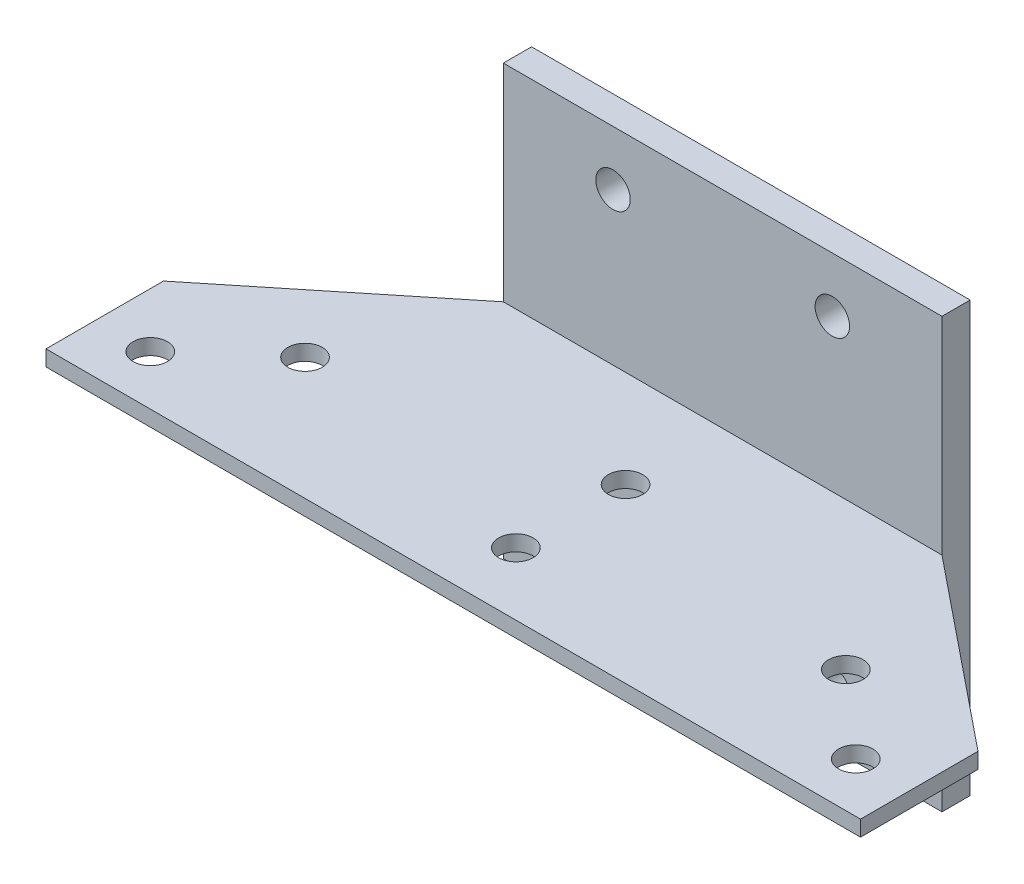
ISO-10303-21;
HEADER;
FILE_DESCRIPTION(('STEP AP214'),'2;1');
FILE_NAME('part.step','',(''),(''),'','','');
FILE_SCHEMA(('AUTOMOTIVE_DESIGN { 1 0 10303 214 1 1 1 1 }'));
ENDSEC;
DATA;
#1=APPLICATION_CONTEXT('core data for automotive mechanical design processes');
#2=APPLICATION_PROTOCOL_DEFINITION('international standard','automotive_design',2000,#1);
#3=PRODUCT_CONTEXT('',#1,'mechanical');
#4=PRODUCT('Part','Part','',(#3));
#5=PRODUCT_RELATED_PRODUCT_CATEGORY('part','',(#4));
#6=PRODUCT_DEFINITION_FORMATION('','',#4);
#7=PRODUCT_DEFINITION_CONTEXT('part definition',#1,'design');
#8=PRODUCT_DEFINITION('design','',#6,#7);
#9=PRODUCT_DEFINITION_SHAPE('','',#8);
#10=(LENGTH_UNIT() NAMED_UNIT(*) SI_UNIT(.MILLI.,.METRE.));
#11=(NAMED_UNIT(*) PLANE_ANGLE_UNIT() SI_UNIT($,.RADIAN.));
#12=(NAMED_UNIT(*) SI_UNIT($,.STERADIAN.) SOLID_ANGLE_UNIT());
#13=UNCERTAINTY_MEASURE_WITH_UNIT(LENGTH_MEASURE(1.E-05),#10,'distance_accuracy_value','');
#14=(GEOMETRIC_REPRESENTATION_CONTEXT(3) GLOBAL_UNCERTAINTY_ASSIGNED_CONTEXT((#13)) GLOBAL_UNIT_ASSIGNED_CONTEXT((#10,
#11,#12)) REPRESENTATION_CONTEXT('',''));
#15=CARTESIAN_POINT('',(0.,0.,0.));
#16=DIRECTION('',(0.,0.,1.));
#17=DIRECTION('',(1.,0.,0.));
#18=AXIS2_PLACEMENT_3D('',#15,#16,#17);
#19=CARTESIAN_POINT('',(0.,274.,18.));
#20=DIRECTION('',(0.,0.,-1.));
#21=DIRECTION('',(-1.,0.,0.));
#22=AXIS2_PLACEMENT_3D('',#19,#20,#21);
#23=PLANE('',#22);
#24=CARTESIAN_POINT('',(70.,239.,18.));
#25=DIRECTION('',(0.,0.,-1.));
#26=DIRECTION('',(-1.,0.,0.));
#27=AXIS2_PLACEMENT_3D('',#24,#25,#26);
#28=CIRCLE('',#27,11.);
#29=CARTESIAN_POINT('',(59.,239.,18.));
#30=VERTEX_POINT('',#29);
#31=EDGE_CURVE('E214',#30,#30,#28,.T.);
#32=ORIENTED_EDGE('',*,*,#31,.T.);
#33=EDGE_LOOP('',(#32));
#34=FACE_BOUND('',#33,.T.);
#35=CARTESIAN_POINT('',(210.,239.,18.));
#36=DIRECTION('',(0.,0.,-1.));
#37=DIRECTION('',(-1.,0.,0.));
#38=AXIS2_PLACEMENT_3D('',#35,#36,#37);
#39=CIRCLE('',#38,11.);
#40=CARTESIAN_POINT('',(199.,239.,18.));
#41=VERTEX_POINT('',#40);
#42=EDGE_CURVE('E226',#41,#41,#39,.T.);
#43=ORIENTED_EDGE('',*,*,#42,.T.);
#44=EDGE_LOOP('',(#43));
#45=FACE_BOUND('',#44,.T.);
#46=DIRECTION('',(-1.,0.,0.));
#47=VECTOR('',#46,1.);
#48=CARTESIAN_POINT('',(-120.,142.,18.));
#49=LINE('',#48,#47);
#50=CARTESIAN_POINT('',(280.,142.,18.));
#51=VERTEX_POINT('',#50);
#52=CARTESIAN_POINT('',(0.,142.,18.));
#53=VERTEX_POINT('',#52);
#54=EDGE_CURVE('E173',#51,#53,#49,.T.);
#55=ORIENTED_EDGE('',*,*,#54,.F.);
#56=DIRECTION('',(0.,1.,0.));
#57=VECTOR('',#56,1.);
#58=CARTESIAN_POINT('',(280.,0.,18.));
#59=LINE('',#58,#57);
#60=CARTESIAN_POINT('',(280.,274.,18.));
#61=VERTEX_POINT('',#60);
#62=EDGE_CURVE('E148',#51,#61,#59,.T.);
#63=ORIENTED_EDGE('',*,*,#62,.T.);
#64=DIRECTION('',(-1.,0.,0.));
#65=VECTOR('',#64,1.);
#66=CARTESIAN_POINT('',(0.,274.,18.));
#67=LINE('',#66,#65);
#68=CARTESIAN_POINT('',(0.,274.,18.));
#69=VERTEX_POINT('',#68);
#70=EDGE_CURVE('E151',#61,#69,#67,.T.);
#71=ORIENTED_EDGE('',*,*,#70,.T.);
#72=DIRECTION('',(0.,-1.,0.));
#73=VECTOR('',#72,1.);
#74=CARTESIAN_POINT('',(0.,0.,18.));
#75=LINE('',#74,#73);
#76=EDGE_CURVE('E141',#69,#53,#75,.T.);
#77=ORIENTED_EDGE('',*,*,#76,.T.);
#78=EDGE_LOOP('',(#55,#63,#71,#77));
#79=FACE_BOUND('',#78,.T.);
#80=ADVANCED_FACE('F31',(#34,#45,#79),#23,.F.);
#81=CARTESIAN_POINT('',(70.,35.,18.));
#82=DIRECTION('',(0.,0.,-1.));
#83=DIRECTION('',(-1.,0.,0.));
#84=AXIS2_PLACEMENT_3D('',#81,#82,#83);
#85=CIRCLE('',#84,11.);
#86=CARTESIAN_POINT('',(59.,35.,18.));
#87=VERTEX_POINT('',#86);
#88=EDGE_CURVE('E220',#87,#87,#85,.T.);
#89=ORIENTED_EDGE('',*,*,#88,.T.);
#90=EDGE_LOOP('',(#89));
#91=FACE_BOUND('',#90,.T.);
#92=CARTESIAN_POINT('',(210.,35.,18.));
#93=DIRECTION('',(0.,0.,-1.));
#94=DIRECTION('',(-1.,0.,0.));
#95=AXIS2_PLACEMENT_3D('',#92,#93,#94);
#96=CIRCLE('',#95,11.);
#97=CARTESIAN_POINT('',(199.,35.,18.));
#98=VERTEX_POINT('',#97);
#99=EDGE_CURVE('E127',#98,#98,#96,.T.);
#100=ORIENTED_EDGE('',*,*,#99,.T.);
#101=EDGE_LOOP('',(#100));
#102=FACE_BOUND('',#101,.T.);
#103=DIRECTION('',(1.,0.,0.));
#104=VECTOR('',#103,1.);
#105=CARTESIAN_POINT('',(-120.,132.,18.));
#106=LINE('',#105,#104);
#107=CARTESIAN_POINT('',(0.,132.,18.));
#108=VERTEX_POINT('',#107);
#109=CARTESIAN_POINT('',(280.,132.,18.));
#110=VERTEX_POINT('',#109);
#111=EDGE_CURVE('E126',#108,#110,#106,.T.);
#112=ORIENTED_EDGE('',*,*,#111,.F.);
#113=CARTESIAN_POINT('',(0.,0.,18.));
#114=VERTEX_POINT('',#113);
#115=EDGE_CURVE('E146',#108,#114,#75,.T.);
#116=ORIENTED_EDGE('',*,*,#115,.T.);
#117=DIRECTION('',(1.,0.,0.));
#118=VECTOR('',#117,1.);
#119=CARTESIAN_POINT('',(0.,0.,18.));
#120=LINE('',#119,#118);
#121=CARTESIAN_POINT('',(280.,0.,18.));
#122=VERTEX_POINT('',#121);
#123=EDGE_CURVE('E144',#114,#122,#120,.T.);
#124=ORIENTED_EDGE('',*,*,#123,.T.);
#125=EDGE_CURVE('E149',#122,#110,#59,.T.);
#126=ORIENTED_EDGE('',*,*,#125,.T.);
#127=EDGE_LOOP('',(#112,#116,#124,#126));
#128=FACE_BOUND('',#127,.T.);
#129=ADVANCED_FACE('F280',(#91,#102,#128),#23,.F.);
#130=CARTESIAN_POINT('',(0.,0.,18.));
#131=DIRECTION('',(1.,0.,0.));
#132=DIRECTION('',(0.,0.,-1.));
#133=AXIS2_PLACEMENT_3D('',#130,#131,#132);
#134=PLANE('',#133);
#135=DIRECTION('',(0.,-1.,0.));
#136=VECTOR('',#135,1.);
#137=CARTESIAN_POINT('',(0.,0.,0.));
#138=LINE('',#137,#136);
#139=CARTESIAN_POINT('',(0.,274.,0.));
#140=VERTEX_POINT('',#139);
#141=CARTESIAN_POINT('',(0.,0.,0.));
#142=VERTEX_POINT('',#141);
#143=EDGE_CURVE('E135',#140,#142,#138,.T.);
#144=ORIENTED_EDGE('',*,*,#143,.T.);
#145=DIRECTION('',(0.,0.,-1.));
#146=VECTOR('',#145,1.);
#147=CARTESIAN_POINT('',(0.,0.,18.));
#148=LINE('',#147,#146);
#149=EDGE_CURVE('E170',#114,#142,#148,.T.);
#150=ORIENTED_EDGE('',*,*,#149,.F.);
#151=ORIENTED_EDGE('',*,*,#115,.F.);
#152=EDGE_CURVE('E145',#53,#108,#75,.T.);
#153=ORIENTED_EDGE('',*,*,#152,.F.);
#154=ORIENTED_EDGE('',*,*,#76,.F.);
#155=DIRECTION('',(0.,0.,-1.));
#156=VECTOR('',#155,1.);
#157=CARTESIAN_POINT('',(0.,274.,18.));
#158=LINE('',#157,#156);
#159=EDGE_CURVE('E153',#69,#140,#158,.T.);
#160=ORIENTED_EDGE('',*,*,#159,.T.);
#161=EDGE_LOOP('',(#144,#150,#151,#153,#154,#160));
#162=FACE_BOUND('',#161,.T.);
#163=ADVANCED_FACE('F33',(#162),#134,.F.);
#164=CARTESIAN_POINT('',(0.,0.,18.));
#165=DIRECTION('',(0.,1.,0.));
#166=DIRECTION('',(0.,0.,1.));
#167=AXIS2_PLACEMENT_3D('',#164,#165,#166);
#168=PLANE('',#167);
#169=DIRECTION('',(1.,0.,0.));
#170=VECTOR('',#169,1.);
#171=CARTESIAN_POINT('',(0.,0.,0.));
#172=LINE('',#171,#170);
#173=CARTESIAN_POINT('',(280.,0.,0.));
#174=VERTEX_POINT('',#173);
#175=EDGE_CURVE('E156',#142,#174,#172,.T.);
#176=ORIENTED_EDGE('',*,*,#175,.T.);
#177=DIRECTION('',(0.,0.,-1.));
#178=VECTOR('',#177,1.);
#179=CARTESIAN_POINT('',(280.,0.,18.));
#180=LINE('',#179,#178);
#181=EDGE_CURVE('E167',#122,#174,#180,.T.);
#182=ORIENTED_EDGE('',*,*,#181,.F.);
#183=ORIENTED_EDGE('',*,*,#123,.F.);
#184=ORIENTED_EDGE('',*,*,#149,.T.);
#185=EDGE_LOOP('',(#176,#182,#183,#184));
#186=FACE_BOUND('',#185,.T.);
#187=ADVANCED_FACE('F277',(#186),#168,.F.);
#188=CARTESIAN_POINT('',(280.,0.,18.));
#189=DIRECTION('',(-1.,0.,0.));
#190=DIRECTION('',(0.,0.,1.));
#191=AXIS2_PLACEMENT_3D('',#188,#189,#190);
#192=PLANE('',#191);
#193=DIRECTION('',(0.,1.,0.));
#194=VECTOR('',#193,1.);
#195=CARTESIAN_POINT('',(280.,0.,0.));
#196=LINE('',#195,#194);
#197=CARTESIAN_POINT('',(280.,274.,0.));
#198=VERTEX_POINT('',#197);
#199=EDGE_CURVE('E158',#174,#198,#196,.T.);
#200=ORIENTED_EDGE('',*,*,#199,.T.);
#201=DIRECTION('',(0.,0.,-1.));
#202=VECTOR('',#201,1.);
#203=CARTESIAN_POINT('',(280.,274.,18.));
#204=LINE('',#203,#202);
#205=EDGE_CURVE('E164',#61,#198,#204,.T.);
#206=ORIENTED_EDGE('',*,*,#205,.F.);
#207=ORIENTED_EDGE('',*,*,#62,.F.);
#208=EDGE_CURVE('E56',#110,#51,#59,.T.);
#209=ORIENTED_EDGE('',*,*,#208,.F.);
#210=ORIENTED_EDGE('',*,*,#125,.F.);
#211=ORIENTED_EDGE('',*,*,#181,.T.);
#212=EDGE_LOOP('',(#200,#206,#207,#209,#210,#211));
#213=FACE_BOUND('',#212,.T.);
#214=ADVANCED_FACE('F282',(#213),#192,.F.);
#215=CARTESIAN_POINT('',(0.,274.,18.));
#216=DIRECTION('',(0.,-1.,0.));
#217=DIRECTION('',(0.,0.,-1.));
#218=AXIS2_PLACEMENT_3D('',#215,#216,#217);
#219=PLANE('',#218);
#220=DIRECTION('',(-1.,0.,0.));
#221=VECTOR('',#220,1.);
#222=CARTESIAN_POINT('',(0.,274.,0.));
#223=LINE('',#222,#221);
#224=EDGE_CURVE('E160',#198,#140,#223,.T.);
#225=ORIENTED_EDGE('',*,*,#224,.T.);
#226=ORIENTED_EDGE('',*,*,#159,.F.);
#227=ORIENTED_EDGE('',*,*,#70,.F.);
#228=ORIENTED_EDGE('',*,*,#205,.T.);
#229=EDGE_LOOP('',(#225,#226,#227,#228));
#230=FACE_BOUND('',#229,.T.);
#231=ADVANCED_FACE('F268',(#230),#219,.F.);
#232=CARTESIAN_POINT('',(0.,274.,0.));
#233=DIRECTION('',(0.,0.,-1.));
#234=DIRECTION('',(-1.,0.,0.));
#235=AXIS2_PLACEMENT_3D('',#232,#233,#234);
#236=PLANE('',#235);
#237=CARTESIAN_POINT('',(70.,239.,0.));
#238=DIRECTION('',(0.,0.,-1.));
#239=DIRECTION('',(-1.,0.,0.));
#240=AXIS2_PLACEMENT_3D('',#237,#238,#239);
#241=CIRCLE('',#240,11.);
#242=CARTESIAN_POINT('',(59.,239.,0.));
#243=VERTEX_POINT('',#242);
#244=EDGE_CURVE('E178',#243,#243,#241,.T.);
#245=ORIENTED_EDGE('',*,*,#244,.F.);
#246=EDGE_LOOP('',(#245));
#247=FACE_BOUND('',#246,.T.);
#248=CARTESIAN_POINT('',(70.,35.,0.));
#249=DIRECTION('',(0.,0.,-1.));
#250=DIRECTION('',(-1.,0.,0.));
#251=AXIS2_PLACEMENT_3D('',#248,#249,#250);
#252=CIRCLE('',#251,11.);
#253=CARTESIAN_POINT('',(59.,35.,0.));
#254=VERTEX_POINT('',#253);
#255=EDGE_CURVE('E217',#254,#254,#252,.T.);
#256=ORIENTED_EDGE('',*,*,#255,.F.);
#257=EDGE_LOOP('',(#256));
#258=FACE_BOUND('',#257,.T.);
#259=CARTESIAN_POINT('',(210.,239.,0.));
#260=DIRECTION('',(0.,0.,-1.));
#261=DIRECTION('',(-1.,0.,0.));
#262=AXIS2_PLACEMENT_3D('',#259,#260,#261);
#263=CIRCLE('',#262,11.);
#264=CARTESIAN_POINT('',(199.,239.,0.));
#265=VERTEX_POINT('',#264);
#266=EDGE_CURVE('E223',#265,#265,#263,.T.);
#267=ORIENTED_EDGE('',*,*,#266,.F.);
#268=EDGE_LOOP('',(#267));
#269=FACE_BOUND('',#268,.T.);
#270=CARTESIAN_POINT('',(210.,35.,0.));
#271=DIRECTION('',(0.,0.,-1.));
#272=DIRECTION('',(-1.,0.,0.));
#273=AXIS2_PLACEMENT_3D('',#270,#271,#272);
#274=CIRCLE('',#273,11.);
#275=CARTESIAN_POINT('',(199.,35.,0.));
#276=VERTEX_POINT('',#275);
#277=EDGE_CURVE('E229',#276,#276,#274,.T.);
#278=ORIENTED_EDGE('',*,*,#277,.F.);
#279=EDGE_LOOP('',(#278));
#280=FACE_BOUND('',#279,.T.);
#281=ORIENTED_EDGE('',*,*,#143,.F.);
#282=ORIENTED_EDGE('',*,*,#224,.F.);
#283=ORIENTED_EDGE('',*,*,#199,.F.);
#284=ORIENTED_EDGE('',*,*,#175,.F.);
#285=EDGE_LOOP('',(#281,#282,#283,#284));
#286=FACE_BOUND('',#285,.T.);
#287=ADVANCED_FACE('F272',(#247,#258,#269,#280,#286),#236,.T.);
#288=CARTESIAN_POINT('',(-120.,142.,190.));
#289=DIRECTION('',(1.,0.,0.));
#290=DIRECTION('',(0.,0.,-1.));
#291=AXIS2_PLACEMENT_3D('',#288,#289,#290);
#292=PLANE('',#291);
#293=DIRECTION('',(0.,0.,-1.));
#294=VECTOR('',#293,1.);
#295=CARTESIAN_POINT('',(-120.,142.,190.));
#296=LINE('',#295,#294);
#297=CARTESIAN_POINT('',(-120.,142.,190.));
#298=VERTEX_POINT('',#297);
#299=CARTESIAN_POINT('',(-120.,142.,115.));
#300=VERTEX_POINT('',#299);
#301=EDGE_CURVE('E137',#298,#300,#296,.T.);
#302=ORIENTED_EDGE('',*,*,#301,.T.);
#303=DIRECTION('',(0.,-1.,0.));
#304=VECTOR('',#303,1.);
#305=CARTESIAN_POINT('',(-120.,274.,115.));
#306=LINE('',#305,#304);
#307=CARTESIAN_POINT('',(-120.,132.,115.));
#308=VERTEX_POINT('',#307);
#309=EDGE_CURVE('E48',#300,#308,#306,.T.);
#310=ORIENTED_EDGE('',*,*,#309,.T.);
#311=DIRECTION('',(0.,0.,-1.));
#312=VECTOR('',#311,1.);
#313=CARTESIAN_POINT('',(-120.,132.,190.));
#314=LINE('',#313,#312);
#315=CARTESIAN_POINT('',(-120.,132.,190.));
#316=VERTEX_POINT('',#315);
#317=EDGE_CURVE('E131',#316,#308,#314,.T.);
#318=ORIENTED_EDGE('',*,*,#317,.F.);
#319=DIRECTION('',(0.,-1.,0.));
#320=VECTOR('',#319,1.);
#321=CARTESIAN_POINT('',(-120.,142.,190.));
#322=LINE('',#321,#320);
#323=EDGE_CURVE('E236',#298,#316,#322,.T.);
#324=ORIENTED_EDGE('',*,*,#323,.F.);
#325=EDGE_LOOP('',(#302,#310,#318,#324));
#326=FACE_BOUND('',#325,.T.);
#327=ADVANCED_FACE('F250',(#326),#292,.F.);
#328=CARTESIAN_POINT('',(-120.,132.,190.));
#329=DIRECTION('',(0.,1.,0.));
#330=DIRECTION('',(-1.,0.,0.));
#331=AXIS2_PLACEMENT_3D('',#328,#329,#330);
#332=PLANE('',#331);
#333=CARTESIAN_POINT('',(312.636595866121,132.,112.));
#334=DIRECTION('',(0.,-1.,0.));
#335=DIRECTION('',(1.,0.,0.));
#336=AXIS2_PLACEMENT_3D('',#333,#334,#335);
#337=CIRCLE('',#336,11.);
#338=CARTESIAN_POINT('',(323.636595866121,132.,112.));
#339=VERTEX_POINT('',#338);
#340=EDGE_CURVE('E203',#339,#339,#337,.T.);
#341=ORIENTED_EDGE('',*,*,#340,.F.);
#342=EDGE_LOOP('',(#341));
#343=FACE_BOUND('',#342,.T.);
#344=CARTESIAN_POINT('',(365.189055635979,132.,158.241096139014));
#345=DIRECTION('',(0.,-1.,0.));
#346=DIRECTION('',(1.,0.,0.));
#347=AXIS2_PLACEMENT_3D('',#344,#345,#346);
#348=CIRCLE('',#347,11.);
#349=CARTESIAN_POINT('',(376.189055635979,132.,158.241096139014));
#350=VERTEX_POINT('',#349);
#351=EDGE_CURVE('E193',#350,#350,#348,.T.);
#352=ORIENTED_EDGE('',*,*,#351,.F.);
#353=EDGE_LOOP('',(#352));
#354=FACE_BOUND('',#353,.T.);
#355=CARTESIAN_POINT('',(-32.6365958661213,132.,112.));
#356=DIRECTION('',(0.,-1.,0.));
#357=DIRECTION('',(1.,0.,0.));
#358=AXIS2_PLACEMENT_3D('',#355,#356,#357);
#359=CIRCLE('',#358,11.);
#360=CARTESIAN_POINT('',(-21.6365958661213,132.,112.));
#361=VERTEX_POINT('',#360);
#362=EDGE_CURVE('E190',#361,#361,#359,.T.);
#363=ORIENTED_EDGE('',*,*,#362,.F.);
#364=EDGE_LOOP('',(#363));
#365=FACE_BOUND('',#364,.T.);
#366=CARTESIAN_POINT('',(-85.1890556359789,132.,158.241096139014));
#367=DIRECTION('',(0.,-1.,0.));
#368=DIRECTION('',(1.,0.,0.));
#369=AXIS2_PLACEMENT_3D('',#366,#367,#368);
#370=CIRCLE('',#369,11.);
#371=CARTESIAN_POINT('',(-74.1890556359789,132.,158.241096139014));
#372=VERTEX_POINT('',#371);
#373=EDGE_CURVE('E187',#372,#372,#370,.T.);
#374=ORIENTED_EDGE('',*,*,#373,.F.);
#375=EDGE_LOOP('',(#374));
#376=FACE_BOUND('',#375,.T.);
#377=CARTESIAN_POINT('',(140.,132.,150.));
#378=DIRECTION('',(0.,-1.,0.));
#379=DIRECTION('',(1.,0.,0.));
#380=AXIS2_PLACEMENT_3D('',#377,#378,#379);
#381=CIRCLE('',#380,11.);
#382=CARTESIAN_POINT('',(151.,132.,150.));
#383=VERTEX_POINT('',#382);
#384=EDGE_CURVE('E183',#383,#383,#381,.T.);
#385=ORIENTED_EDGE('',*,*,#384,.F.);
#386=EDGE_LOOP('',(#385));
#387=FACE_BOUND('',#386,.T.);
#388=CARTESIAN_POINT('',(140.,132.,80.));
#389=DIRECTION('',(0.,-1.,0.));
#390=DIRECTION('',(1.,0.,0.));
#391=AXIS2_PLACEMENT_3D('',#388,#389,#390);
#392=CIRCLE('',#391,11.);
#393=CARTESIAN_POINT('',(151.,132.,80.));
#394=VERTEX_POINT('',#393);
#395=EDGE_CURVE('E179',#394,#394,#392,.T.);
#396=ORIENTED_EDGE('',*,*,#395,.F.);
#397=EDGE_LOOP('',(#396));
#398=FACE_BOUND('',#397,.T.);
#399=ORIENTED_EDGE('',*,*,#111,.T.);
#400=DIRECTION('',(-0.777697438527818,0.,-0.628638762809986));
#401=VECTOR('',#400,1.);
#402=CARTESIAN_POINT('',(400.,132.,115.));
#403=LINE('',#402,#401);
#404=CARTESIAN_POINT('',(400.,132.,115.));
#405=VERTEX_POINT('',#404);
#406=EDGE_CURVE('E110',#405,#110,#403,.T.);
#407=ORIENTED_EDGE('',*,*,#406,.F.);
#408=DIRECTION('',(0.,0.,-1.));
#409=VECTOR('',#408,1.);
#410=CARTESIAN_POINT('',(400.,132.,190.));
#411=LINE('',#410,#409);
#412=CARTESIAN_POINT('',(400.,132.,190.));
#413=VERTEX_POINT('',#412);
#414=EDGE_CURVE('E122',#413,#405,#411,.T.);
#415=ORIENTED_EDGE('',*,*,#414,.F.);
#416=DIRECTION('',(1.,0.,0.));
#417=VECTOR('',#416,1.);
#418=CARTESIAN_POINT('',(-120.,132.,190.));
#419=LINE('',#418,#417);
#420=EDGE_CURVE('E239',#316,#413,#419,.T.);
#421=ORIENTED_EDGE('',*,*,#420,.F.);
#422=ORIENTED_EDGE('',*,*,#317,.T.);
#423=DIRECTION('',(-0.777697438527818,0.,0.628638762809986));
#424=VECTOR('',#423,1.);
#425=CARTESIAN_POINT('',(0.,132.,18.));
#426=LINE('',#425,#424);
#427=EDGE_CURVE('E116',#108,#308,#426,.T.);
#428=ORIENTED_EDGE('',*,*,#427,.F.);
#429=EDGE_LOOP('',(#399,#407,#415,#421,#422,#428));
#430=FACE_BOUND('',#429,.T.);
#431=ADVANCED_FACE('F121',(#343,#354,#365,#376,#387,#398,#430),#332,.F.);
#432=CARTESIAN_POINT('',(400.,142.,190.));
#433=DIRECTION('',(-1.,0.,0.));
#434=DIRECTION('',(0.,0.,1.));
#435=AXIS2_PLACEMENT_3D('',#432,#433,#434);
#436=PLANE('',#435);
#437=ORIENTED_EDGE('',*,*,#414,.T.);
#438=DIRECTION('',(0.,-1.,0.));
#439=VECTOR('',#438,1.);
#440=CARTESIAN_POINT('',(400.,274.,115.));
#441=LINE('',#440,#439);
#442=CARTESIAN_POINT('',(400.,142.,115.));
#443=VERTEX_POINT('',#442);
#444=EDGE_CURVE('E107',#443,#405,#441,.T.);
#445=ORIENTED_EDGE('',*,*,#444,.F.);
#446=DIRECTION('',(0.,0.,-1.));
#447=VECTOR('',#446,1.);
#448=CARTESIAN_POINT('',(400.,142.,190.));
#449=LINE('',#448,#447);
#450=CARTESIAN_POINT('',(400.,142.,190.));
#451=VERTEX_POINT('',#450);
#452=EDGE_CURVE('E132',#451,#443,#449,.T.);
#453=ORIENTED_EDGE('',*,*,#452,.F.);
#454=DIRECTION('',(0.,1.,0.));
#455=VECTOR('',#454,1.);
#456=CARTESIAN_POINT('',(400.,142.,190.));
#457=LINE('',#456,#455);
#458=EDGE_CURVE('E130',#413,#451,#457,.T.);
#459=ORIENTED_EDGE('',*,*,#458,.F.);
#460=EDGE_LOOP('',(#437,#445,#453,#459));
#461=FACE_BOUND('',#460,.T.);
#462=ADVANCED_FACE('F129',(#461),#436,.F.);
#463=CARTESIAN_POINT('',(-120.,142.,190.));
#464=DIRECTION('',(0.,-1.,0.));
#465=DIRECTION('',(1.,0.,0.));
#466=AXIS2_PLACEMENT_3D('',#463,#464,#465);
#467=PLANE('',#466);
#468=CARTESIAN_POINT('',(312.636595866121,142.,112.));
#469=DIRECTION('',(0.,-1.,0.));
#470=DIRECTION('',(1.,0.,0.));
#471=AXIS2_PLACEMENT_3D('',#468,#469,#470);
#472=CIRCLE('',#471,11.);
#473=CARTESIAN_POINT('',(323.636595866121,142.,112.));
#474=VERTEX_POINT('',#473);
#475=EDGE_CURVE('E35',#474,#474,#472,.T.);
#476=ORIENTED_EDGE('',*,*,#475,.T.);
#477=EDGE_LOOP('',(#476));
#478=FACE_BOUND('',#477,.T.);
#479=CARTESIAN_POINT('',(365.189055635979,142.,158.241096139014));
#480=DIRECTION('',(0.,-1.,0.));
#481=DIRECTION('',(1.,0.,0.));
#482=AXIS2_PLACEMENT_3D('',#479,#480,#481);
#483=CIRCLE('',#482,11.);
#484=CARTESIAN_POINT('',(376.189055635979,142.,158.241096139014));
#485=VERTEX_POINT('',#484);
#486=EDGE_CURVE('E191',#485,#485,#483,.T.);
#487=ORIENTED_EDGE('',*,*,#486,.T.);
#488=EDGE_LOOP('',(#487));
#489=FACE_BOUND('',#488,.T.);
#490=CARTESIAN_POINT('',(-32.6365958661213,142.,112.));
#491=DIRECTION('',(0.,-1.,0.));
#492=DIRECTION('',(1.,0.,0.));
#493=AXIS2_PLACEMENT_3D('',#490,#491,#492);
#494=CIRCLE('',#493,11.);
#495=CARTESIAN_POINT('',(-21.6365958661213,142.,112.));
#496=VERTEX_POINT('',#495);
#497=EDGE_CURVE('E188',#496,#496,#494,.T.);
#498=ORIENTED_EDGE('',*,*,#497,.T.);
#499=EDGE_LOOP('',(#498));
#500=FACE_BOUND('',#499,.T.);
#501=CARTESIAN_POINT('',(-85.1890556359789,142.,158.241096139014));
#502=DIRECTION('',(0.,-1.,0.));
#503=DIRECTION('',(1.,0.,0.));
#504=AXIS2_PLACEMENT_3D('',#501,#502,#503);
#505=CIRCLE('',#504,11.);
#506=CARTESIAN_POINT('',(-74.1890556359789,142.,158.241096139014));
#507=VERTEX_POINT('',#506);
#508=EDGE_CURVE('E184',#507,#507,#505,.T.);
#509=ORIENTED_EDGE('',*,*,#508,.T.);
#510=EDGE_LOOP('',(#509));
#511=FACE_BOUND('',#510,.T.);
#512=CARTESIAN_POINT('',(140.,142.,150.));
#513=DIRECTION('',(0.,-1.,0.));
#514=DIRECTION('',(1.,0.,0.));
#515=AXIS2_PLACEMENT_3D('',#512,#513,#514);
#516=CIRCLE('',#515,11.);
#517=CARTESIAN_POINT('',(151.,142.,150.));
#518=VERTEX_POINT('',#517);
#519=EDGE_CURVE('E180',#518,#518,#516,.T.);
#520=ORIENTED_EDGE('',*,*,#519,.T.);
#521=EDGE_LOOP('',(#520));
#522=FACE_BOUND('',#521,.T.);
#523=CARTESIAN_POINT('',(140.,142.,80.));
#524=DIRECTION('',(0.,-1.,0.));
#525=DIRECTION('',(1.,0.,0.));
#526=AXIS2_PLACEMENT_3D('',#523,#524,#525);
#527=CIRCLE('',#526,11.);
#528=CARTESIAN_POINT('',(151.,142.,80.));
#529=VERTEX_POINT('',#528);
#530=EDGE_CURVE('E175',#529,#529,#527,.T.);
#531=ORIENTED_EDGE('',*,*,#530,.T.);
#532=EDGE_LOOP('',(#531));
#533=FACE_BOUND('',#532,.T.);
#534=ORIENTED_EDGE('',*,*,#452,.T.);
#535=DIRECTION('',(-0.777697438527818,0.,-0.628638762809986));
#536=VECTOR('',#535,1.);
#537=CARTESIAN_POINT('',(122.163887605527,142.,-109.584190852199));
#538=LINE('',#537,#536);
#539=EDGE_CURVE('E11',#443,#51,#538,.T.);
#540=ORIENTED_EDGE('',*,*,#539,.T.);
#541=ORIENTED_EDGE('',*,*,#54,.T.);
#542=DIRECTION('',(-0.777697438527818,0.,0.628638762809986));
#543=VECTOR('',#542,1.);
#544=CARTESIAN_POINT('',(-156.666806669747,142.,144.639002058045));
#545=LINE('',#544,#543);
#546=EDGE_CURVE('E40',#53,#300,#545,.T.);
#547=ORIENTED_EDGE('',*,*,#546,.T.);
#548=ORIENTED_EDGE('',*,*,#301,.F.);
#549=DIRECTION('',(-1.,0.,0.));
#550=VECTOR('',#549,1.);
#551=CARTESIAN_POINT('',(-120.,142.,190.));
#552=LINE('',#551,#550);
#553=EDGE_CURVE('E242',#451,#298,#552,.T.);
#554=ORIENTED_EDGE('',*,*,#553,.F.);
#555=EDGE_LOOP('',(#534,#540,#541,#547,#548,#554));
#556=FACE_BOUND('',#555,.T.);
#557=ADVANCED_FACE('F254',(#478,#489,#500,#511,#522,#533,#556),#467,.F.);
#558=CARTESIAN_POINT('',(-120.,142.,190.));
#559=DIRECTION('',(0.,0.,1.));
#560=DIRECTION('',(1.,0.,0.));
#561=AXIS2_PLACEMENT_3D('',#558,#559,#560);
#562=PLANE('',#561);
#563=ORIENTED_EDGE('',*,*,#323,.T.);
#564=ORIENTED_EDGE('',*,*,#420,.T.);
#565=ORIENTED_EDGE('',*,*,#458,.T.);
#566=ORIENTED_EDGE('',*,*,#553,.T.);
#567=EDGE_LOOP('',(#563,#564,#565,#566));
#568=FACE_BOUND('',#567,.T.);
#569=ADVANCED_FACE('F333',(#568),#562,.T.);
#570=CARTESIAN_POINT('',(0.,274.,18.));
#571=DIRECTION('',(0.628638762809986,0.,0.777697438527818));
#572=DIRECTION('',(0.777697438527818,0.,-0.628638762809986));
#573=AXIS2_PLACEMENT_3D('',#570,#571,#572);
#574=PLANE('',#573);
#575=ORIENTED_EDGE('',*,*,#152,.T.);
#576=ORIENTED_EDGE('',*,*,#427,.T.);
#577=ORIENTED_EDGE('',*,*,#309,.F.);
#578=ORIENTED_EDGE('',*,*,#546,.F.);
#579=EDGE_LOOP('',(#575,#576,#577,#578));
#580=FACE_BOUND('',#579,.T.);
#581=ADVANCED_FACE('F257',(#580),#574,.F.);
#582=CARTESIAN_POINT('',(400.,274.,115.));
#583=DIRECTION('',(-0.628638762809986,0.,0.777697438527818));
#584=DIRECTION('',(0.777697438527818,0.,0.628638762809986));
#585=AXIS2_PLACEMENT_3D('',#582,#583,#584);
#586=PLANE('',#585);
#587=ORIENTED_EDGE('',*,*,#444,.T.);
#588=ORIENTED_EDGE('',*,*,#406,.T.);
#589=ORIENTED_EDGE('',*,*,#208,.T.);
#590=ORIENTED_EDGE('',*,*,#539,.F.);
#591=EDGE_LOOP('',(#587,#588,#589,#590));
#592=FACE_BOUND('',#591,.T.);
#593=ADVANCED_FACE('F109',(#592),#586,.F.);
#594=CARTESIAN_POINT('',(210.,35.,190.));
#595=DIRECTION('',(0.,0.,-1.));
#596=DIRECTION('',(-1.,0.,0.));
#597=AXIS2_PLACEMENT_3D('',#594,#595,#596);
#598=CYLINDRICAL_SURFACE('',#597,11.);
#599=CARTESIAN_POINT('',(199.,35.,0.));
#600=CARTESIAN_POINT('',(199.,35.,0.187499999999998));
#601=CARTESIAN_POINT('',(199.,35.,0.374999999999996));
#602=CARTESIAN_POINT('',(199.,35.,0.749999999999991));
#603=CARTESIAN_POINT('',(199.,35.,0.937499999999989));
#604=CARTESIAN_POINT('',(199.,35.,1.31249999999999));
#605=CARTESIAN_POINT('',(199.,35.,1.5));
#606=CARTESIAN_POINT('',(199.,35.,1.87500000000001));
#607=CARTESIAN_POINT('',(199.,35.,2.0625));
#608=CARTESIAN_POINT('',(199.,35.,2.4375));
#609=CARTESIAN_POINT('',(199.,35.,2.625));
#610=CARTESIAN_POINT('',(199.,35.,3.));
#611=CARTESIAN_POINT('',(199.,35.,3.18750000000001));
#612=CARTESIAN_POINT('',(199.,35.,3.56250000000001));
#613=CARTESIAN_POINT('',(199.,35.,3.75000000000001));
#614=CARTESIAN_POINT('',(199.,35.,4.12500000000001));
#615=CARTESIAN_POINT('',(199.,35.,4.31250000000001));
#616=CARTESIAN_POINT('',(199.,35.,4.6875));
#617=CARTESIAN_POINT('',(199.,35.,4.875));
#618=CARTESIAN_POINT('',(199.,35.,5.25));
#619=CARTESIAN_POINT('',(199.,35.,5.43749999999999));
#620=CARTESIAN_POINT('',(199.,35.,5.8125));
#621=CARTESIAN_POINT('',(199.,35.,6.00000000000001));
#622=CARTESIAN_POINT('',(199.,35.,6.37500000000001));
#623=CARTESIAN_POINT('',(199.,35.,6.56250000000001));
#624=CARTESIAN_POINT('',(199.,35.,6.9375));
#625=CARTESIAN_POINT('',(199.,35.,7.125));
#626=CARTESIAN_POINT('',(199.,35.,7.50000000000001));
#627=CARTESIAN_POINT('',(199.,35.,7.68750000000001));
#628=CARTESIAN_POINT('',(199.,35.,8.06250000000002));
#629=CARTESIAN_POINT('',(199.,35.,8.25000000000002));
#630=CARTESIAN_POINT('',(199.,35.,8.62500000000001));
#631=CARTESIAN_POINT('',(199.,35.,8.81250000000001));
#632=CARTESIAN_POINT('',(199.,35.,9.18750000000001));
#633=CARTESIAN_POINT('',(199.,35.,9.375));
#634=CARTESIAN_POINT('',(199.,35.,9.75));
#635=CARTESIAN_POINT('',(199.,35.,9.9375));
#636=CARTESIAN_POINT('',(199.,35.,10.3125));
#637=CARTESIAN_POINT('',(199.,35.,10.5));
#638=CARTESIAN_POINT('',(199.,35.,10.875));
#639=CARTESIAN_POINT('',(199.,35.,11.0625));
#640=CARTESIAN_POINT('',(199.,35.,11.4375));
#641=CARTESIAN_POINT('',(199.,35.,11.625));
#642=CARTESIAN_POINT('',(199.,35.,12.));
#643=CARTESIAN_POINT('',(199.,35.,12.1875));
#644=CARTESIAN_POINT('',(199.,35.,12.5625));
#645=CARTESIAN_POINT('',(199.,35.,12.75));
#646=CARTESIAN_POINT('',(199.,35.,13.125));
#647=CARTESIAN_POINT('',(199.,35.,13.3125));
#648=CARTESIAN_POINT('',(199.,35.,13.6875));
#649=CARTESIAN_POINT('',(199.,35.,13.875));
#650=CARTESIAN_POINT('',(199.,35.,14.25));
#651=CARTESIAN_POINT('',(199.,35.,14.4375));
#652=CARTESIAN_POINT('',(199.,35.,14.8125));
#653=CARTESIAN_POINT('',(199.,35.,15.));
#654=CARTESIAN_POINT('',(199.,35.,15.375));
#655=CARTESIAN_POINT('',(199.,35.,15.5625));
#656=CARTESIAN_POINT('',(199.,35.,15.9375));
#657=CARTESIAN_POINT('',(199.,35.,16.125));
#658=CARTESIAN_POINT('',(199.,35.,16.5));
#659=CARTESIAN_POINT('',(199.,35.,16.6875));
#660=CARTESIAN_POINT('',(199.,35.,17.0625));
#661=CARTESIAN_POINT('',(199.,35.,17.25));
#662=CARTESIAN_POINT('',(199.,35.,17.625));
#663=CARTESIAN_POINT('',(199.,35.,17.8125));
#664=CARTESIAN_POINT('',(199.,35.,18.));
#665=B_SPLINE_CURVE_WITH_KNOTS('',3,(#599,#600,#601,#602,#603,#604,#605,#606,#607,#608,#609,
#610,#611,#612,#613,#614,#615,#616,#617,#618,#619,#620,#621,#622,#623,#624,#625,#626,#627,#628,
#629,#630,#631,#632,#633,#634,#635,#636,#637,#638,#639,#640,#641,#642,#643,#644,#645,#646,#647,
#648,#649,#650,#651,#652,#653,#654,#655,#656,#657,#658,#659,#660,#661,#662,#663,#664),
.UNSPECIFIED.,.F.,.F.,(4,2,2,2,2,2,2,2,2,2,2,2,2,2,2,2,2,2,2,2,2,2,2,2,2,2,2,2,2,2,2,2,4),(0.,
0.562499999999994,1.12499999999999,1.68750000000001,2.25,2.8125,3.37500000000002,
3.93750000000001,4.5,5.0625,5.62499999999999,6.18750000000001,6.75000000000001,7.3125,
7.87500000000002,8.43750000000001,9.00000000000001,9.5625,10.125,10.6875,11.25,11.8125,12.375,
12.9375,13.5,14.0625,14.625,15.1875,15.75,16.3125,16.875,17.4375,18.),.UNSPECIFIED.);
#666=EDGE_CURVE('BSEAM314',#276,#98,#665,.T.);
#667=ORIENTED_EDGE('',*,*,#277,.T.);
#668=ORIENTED_EDGE('',*,*,#99,.F.);
#669=ORIENTED_EDGE('',*,*,#666,.T.);
#670=ORIENTED_EDGE('',*,*,#666,.F.);
#671=EDGE_LOOP('',(#667,#669,#668,#670));
#672=FACE_BOUND('',#671,.T.);
#673=ADVANCED_FACE('F314',(#672),#598,.F.);
#674=CARTESIAN_POINT('',(210.,239.,190.));
#675=DIRECTION('',(0.,0.,-1.));
#676=DIRECTION('',(-1.,0.,0.));
#677=AXIS2_PLACEMENT_3D('',#674,#675,#676);
#678=CYLINDRICAL_SURFACE('',#677,11.);
#679=CARTESIAN_POINT('',(199.,239.,0.));
#680=CARTESIAN_POINT('',(199.,239.,0.187499999999998));
#681=CARTESIAN_POINT('',(199.,239.,0.374999999999996));
#682=CARTESIAN_POINT('',(199.,239.,0.749999999999991));
#683=CARTESIAN_POINT('',(199.,239.,0.937499999999989));
#684=CARTESIAN_POINT('',(199.,239.,1.31249999999999));
#685=CARTESIAN_POINT('',(199.,239.,1.5));
#686=CARTESIAN_POINT('',(199.,239.,1.87500000000001));
#687=CARTESIAN_POINT('',(199.,239.,2.0625));
#688=CARTESIAN_POINT('',(199.,239.,2.4375));
#689=CARTESIAN_POINT('',(199.,239.,2.625));
#690=CARTESIAN_POINT('',(199.,239.,3.));
#691=CARTESIAN_POINT('',(199.,239.,3.18750000000001));
#692=CARTESIAN_POINT('',(199.,239.,3.56250000000001));
#693=CARTESIAN_POINT('',(199.,239.,3.75000000000001));
#694=CARTESIAN_POINT('',(199.,239.,4.12500000000001));
#695=CARTESIAN_POINT('',(199.,239.,4.31250000000001));
#696=CARTESIAN_POINT('',(199.,239.,4.6875));
#697=CARTESIAN_POINT('',(199.,239.,4.875));
#698=CARTESIAN_POINT('',(199.,239.,5.25));
#699=CARTESIAN_POINT('',(199.,239.,5.43749999999999));
#700=CARTESIAN_POINT('',(199.,239.,5.8125));
#701=CARTESIAN_POINT('',(199.,239.,6.00000000000001));
#702=CARTESIAN_POINT('',(199.,239.,6.37500000000001));
#703=CARTESIAN_POINT('',(199.,239.,6.56250000000001));
#704=CARTESIAN_POINT('',(199.,239.,6.9375));
#705=CARTESIAN_POINT('',(199.,239.,7.125));
#706=CARTESIAN_POINT('',(199.,239.,7.50000000000001));
#707=CARTESIAN_POINT('',(199.,239.,7.68750000000001));
#708=CARTESIAN_POINT('',(199.,239.,8.06250000000002));
#709=CARTESIAN_POINT('',(199.,239.,8.25000000000002));
#710=CARTESIAN_POINT('',(199.,239.,8.62500000000001));
#711=CARTESIAN_POINT('',(199.,239.,8.81250000000001));
#712=CARTESIAN_POINT('',(199.,239.,9.18750000000001));
#713=CARTESIAN_POINT('',(199.,239.,9.375));
#714=CARTESIAN_POINT('',(199.,239.,9.75));
#715=CARTESIAN_POINT('',(199.,239.,9.9375));
#716=CARTESIAN_POINT('',(199.,239.,10.3125));
#717=CARTESIAN_POINT('',(199.,239.,10.5));
#718=CARTESIAN_POINT('',(199.,239.,10.875));
#719=CARTESIAN_POINT('',(199.,239.,11.0625));
#720=CARTESIAN_POINT('',(199.,239.,11.4375));
#721=CARTESIAN_POINT('',(199.,239.,11.625));
#722=CARTESIAN_POINT('',(199.,239.,12.));
#723=CARTESIAN_POINT('',(199.,239.,12.1875));
#724=CARTESIAN_POINT('',(199.,239.,12.5625));
#725=CARTESIAN_POINT('',(199.,239.,12.75));
#726=CARTESIAN_POINT('',(199.,239.,13.125));
#727=CARTESIAN_POINT('',(199.,239.,13.3125));
#728=CARTESIAN_POINT('',(199.,239.,13.6875));
#729=CARTESIAN_POINT('',(199.,239.,13.875));
#730=CARTESIAN_POINT('',(199.,239.,14.25));
#731=CARTESIAN_POINT('',(199.,239.,14.4375));
#732=CARTESIAN_POINT('',(199.,239.,14.8125));
#733=CARTESIAN_POINT('',(199.,239.,15.));
#734=CARTESIAN_POINT('',(199.,239.,15.375));
#735=CARTESIAN_POINT('',(199.,239.,15.5625));
#736=CARTESIAN_POINT('',(199.,239.,15.9375));
#737=CARTESIAN_POINT('',(199.,239.,16.125));
#738=CARTESIAN_POINT('',(199.,239.,16.5));
#739=CARTESIAN_POINT('',(199.,239.,16.6875));
#740=CARTESIAN_POINT('',(199.,239.,17.0625));
#741=CARTESIAN_POINT('',(199.,239.,17.25));
#742=CARTESIAN_POINT('',(199.,239.,17.625));
#743=CARTESIAN_POINT('',(199.,239.,17.8125));
#744=CARTESIAN_POINT('',(199.,239.,18.));
#745=B_SPLINE_CURVE_WITH_KNOTS('',3,(#679,#680,#681,#682,#683,#684,#685,#686,#687,#688,#689,
#690,#691,#692,#693,#694,#695,#696,#697,#698,#699,#700,#701,#702,#703,#704,#705,#706,#707,#708,
#709,#710,#711,#712,#713,#714,#715,#716,#717,#718,#719,#720,#721,#722,#723,#724,#725,#726,#727,
#728,#729,#730,#731,#732,#733,#734,#735,#736,#737,#738,#739,#740,#741,#742,#743,#744),
.UNSPECIFIED.,.F.,.F.,(4,2,2,2,2,2,2,2,2,2,2,2,2,2,2,2,2,2,2,2,2,2,2,2,2,2,2,2,2,2,2,2,4),(0.,
0.562499999999994,1.12499999999999,1.68750000000001,2.25,2.8125,3.37500000000002,
3.93750000000001,4.5,5.0625,5.62499999999999,6.18750000000001,6.75000000000001,7.3125,
7.87500000000002,8.43750000000001,9.00000000000001,9.5625,10.125,10.6875,11.25,11.8125,12.375,
12.9375,13.5,14.0625,14.625,15.1875,15.75,16.3125,16.875,17.4375,18.),.UNSPECIFIED.);
#746=EDGE_CURVE('BSEAM317',#265,#41,#745,.T.);
#747=ORIENTED_EDGE('',*,*,#266,.T.);
#748=ORIENTED_EDGE('',*,*,#42,.F.);
#749=ORIENTED_EDGE('',*,*,#746,.T.);
#750=ORIENTED_EDGE('',*,*,#746,.F.);
#751=EDGE_LOOP('',(#747,#749,#748,#750));
#752=FACE_BOUND('',#751,.T.);
#753=ADVANCED_FACE('F317',(#752),#678,.F.);
#754=CARTESIAN_POINT('',(70.,35.,190.));
#755=DIRECTION('',(0.,0.,-1.));
#756=DIRECTION('',(-1.,0.,0.));
#757=AXIS2_PLACEMENT_3D('',#754,#755,#756);
#758=CYLINDRICAL_SURFACE('',#757,11.);
#759=CARTESIAN_POINT('',(59.,35.,0.));
#760=CARTESIAN_POINT('',(59.,35.,0.187499999999998));
#761=CARTESIAN_POINT('',(59.,35.,0.374999999999996));
#762=CARTESIAN_POINT('',(59.,35.,0.749999999999991));
#763=CARTESIAN_POINT('',(59.,35.,0.937499999999989));
#764=CARTESIAN_POINT('',(59.,35.,1.31249999999999));
#765=CARTESIAN_POINT('',(59.,35.,1.5));
#766=CARTESIAN_POINT('',(59.,35.,1.87500000000001));
#767=CARTESIAN_POINT('',(59.,35.,2.0625));
#768=CARTESIAN_POINT('',(59.,35.,2.4375));
#769=CARTESIAN_POINT('',(59.,35.,2.625));
#770=CARTESIAN_POINT('',(59.,35.,3.));
#771=CARTESIAN_POINT('',(59.,35.,3.18750000000001));
#772=CARTESIAN_POINT('',(59.,35.,3.56250000000001));
#773=CARTESIAN_POINT('',(59.,35.,3.75000000000001));
#774=CARTESIAN_POINT('',(59.,35.,4.12500000000001));
#775=CARTESIAN_POINT('',(59.,35.,4.31250000000001));
#776=CARTESIAN_POINT('',(59.,35.,4.6875));
#777=CARTESIAN_POINT('',(59.,35.,4.875));
#778=CARTESIAN_POINT('',(59.,35.,5.25));
#779=CARTESIAN_POINT('',(59.,35.,5.43749999999999));
#780=CARTESIAN_POINT('',(59.,35.,5.8125));
#781=CARTESIAN_POINT('',(59.,35.,6.00000000000001));
#782=CARTESIAN_POINT('',(59.,35.,6.37500000000001));
#783=CARTESIAN_POINT('',(59.,35.,6.56250000000001));
#784=CARTESIAN_POINT('',(59.,35.,6.9375));
#785=CARTESIAN_POINT('',(59.,35.,7.125));
#786=CARTESIAN_POINT('',(59.,35.,7.50000000000001));
#787=CARTESIAN_POINT('',(59.,35.,7.68750000000001));
#788=CARTESIAN_POINT('',(59.,35.,8.06250000000002));
#789=CARTESIAN_POINT('',(59.,35.,8.25000000000002));
#790=CARTESIAN_POINT('',(59.,35.,8.62500000000001));
#791=CARTESIAN_POINT('',(59.,35.,8.81250000000001));
#792=CARTESIAN_POINT('',(59.,35.,9.18750000000001));
#793=CARTESIAN_POINT('',(59.,35.,9.375));
#794=CARTESIAN_POINT('',(59.,35.,9.75));
#795=CARTESIAN_POINT('',(59.,35.,9.9375));
#796=CARTESIAN_POINT('',(59.,35.,10.3125));
#797=CARTESIAN_POINT('',(59.,35.,10.5));
#798=CARTESIAN_POINT('',(59.,35.,10.875));
#799=CARTESIAN_POINT('',(59.,35.,11.0625));
#800=CARTESIAN_POINT('',(59.,35.,11.4375));
#801=CARTESIAN_POINT('',(59.,35.,11.625));
#802=CARTESIAN_POINT('',(59.,35.,12.));
#803=CARTESIAN_POINT('',(59.,35.,12.1875));
#804=CARTESIAN_POINT('',(59.,35.,12.5625));
#805=CARTESIAN_POINT('',(59.,35.,12.75));
#806=CARTESIAN_POINT('',(59.,35.,13.125));
#807=CARTESIAN_POINT('',(59.,35.,13.3125));
#808=CARTESIAN_POINT('',(59.,35.,13.6875));
#809=CARTESIAN_POINT('',(59.,35.,13.875));
#810=CARTESIAN_POINT('',(59.,35.,14.25));
#811=CARTESIAN_POINT('',(59.,35.,14.4375));
#812=CARTESIAN_POINT('',(59.,35.,14.8125));
#813=CARTESIAN_POINT('',(59.,35.,15.));
#814=CARTESIAN_POINT('',(59.,35.,15.375));
#815=CARTESIAN_POINT('',(59.,35.,15.5625));
#816=CARTESIAN_POINT('',(59.,35.,15.9375));
#817=CARTESIAN_POINT('',(59.,35.,16.125));
#818=CARTESIAN_POINT('',(59.,35.,16.5));
#819=CARTESIAN_POINT('',(59.,35.,16.6875));
#820=CARTESIAN_POINT('',(59.,35.,17.0625));
#821=CARTESIAN_POINT('',(59.,35.,17.25));
#822=CARTESIAN_POINT('',(59.,35.,17.625));
#823=CARTESIAN_POINT('',(59.,35.,17.8125));
#824=CARTESIAN_POINT('',(59.,35.,18.));
#825=B_SPLINE_CURVE_WITH_KNOTS('',3,(#759,#760,#761,#762,#763,#764,#765,#766,#767,#768,#769,
#770,#771,#772,#773,#774,#775,#776,#777,#778,#779,#780,#781,#782,#783,#784,#785,#786,#787,#788,
#789,#790,#791,#792,#793,#794,#795,#796,#797,#798,#799,#800,#801,#802,#803,#804,#805,#806,#807,
#808,#809,#810,#811,#812,#813,#814,#815,#816,#817,#818,#819,#820,#821,#822,#823,#824),
.UNSPECIFIED.,.F.,.F.,(4,2,2,2,2,2,2,2,2,2,2,2,2,2,2,2,2,2,2,2,2,2,2,2,2,2,2,2,2,2,2,2,4),(0.,
0.562499999999994,1.12499999999999,1.68750000000001,2.25,2.8125,3.37500000000002,
3.93750000000001,4.5,5.0625,5.62499999999999,6.18750000000001,6.75000000000001,7.3125,
7.87500000000002,8.43750000000001,9.00000000000001,9.5625,10.125,10.6875,11.25,11.8125,12.375,
12.9375,13.5,14.0625,14.625,15.1875,15.75,16.3125,16.875,17.4375,18.),.UNSPECIFIED.);
#826=EDGE_CURVE('BSEAM325',#254,#87,#825,.T.);
#827=ORIENTED_EDGE('',*,*,#255,.T.);
#828=ORIENTED_EDGE('',*,*,#88,.F.);
#829=ORIENTED_EDGE('',*,*,#826,.T.);
#830=ORIENTED_EDGE('',*,*,#826,.F.);
#831=EDGE_LOOP('',(#827,#829,#828,#830));
#832=FACE_BOUND('',#831,.T.);
#833=ADVANCED_FACE('F325',(#832),#758,.F.);
#834=CARTESIAN_POINT('',(70.,239.,190.));
#835=DIRECTION('',(0.,0.,-1.));
#836=DIRECTION('',(-1.,0.,0.));
#837=AXIS2_PLACEMENT_3D('',#834,#835,#836);
#838=CYLINDRICAL_SURFACE('',#837,11.);
#839=CARTESIAN_POINT('',(59.,239.,0.));
#840=CARTESIAN_POINT('',(59.,239.,0.187499999999998));
#841=CARTESIAN_POINT('',(59.,239.,0.374999999999996));
#842=CARTESIAN_POINT('',(59.,239.,0.749999999999991));
#843=CARTESIAN_POINT('',(59.,239.,0.937499999999989));
#844=CARTESIAN_POINT('',(59.,239.,1.31249999999999));
#845=CARTESIAN_POINT('',(59.,239.,1.5));
#846=CARTESIAN_POINT('',(59.,239.,1.87500000000001));
#847=CARTESIAN_POINT('',(59.,239.,2.0625));
#848=CARTESIAN_POINT('',(59.,239.,2.4375));
#849=CARTESIAN_POINT('',(59.,239.,2.625));
#850=CARTESIAN_POINT('',(59.,239.,3.));
#851=CARTESIAN_POINT('',(59.,239.,3.18750000000001));
#852=CARTESIAN_POINT('',(59.,239.,3.56250000000001));
#853=CARTESIAN_POINT('',(59.,239.,3.75000000000001));
#854=CARTESIAN_POINT('',(59.,239.,4.12500000000001));
#855=CARTESIAN_POINT('',(59.,239.,4.31250000000001));
#856=CARTESIAN_POINT('',(59.,239.,4.6875));
#857=CARTESIAN_POINT('',(59.,239.,4.875));
#858=CARTESIAN_POINT('',(59.,239.,5.25));
#859=CARTESIAN_POINT('',(59.,239.,5.43749999999999));
#860=CARTESIAN_POINT('',(59.,239.,5.8125));
#861=CARTESIAN_POINT('',(59.,239.,6.00000000000001));
#862=CARTESIAN_POINT('',(59.,239.,6.37500000000001));
#863=CARTESIAN_POINT('',(59.,239.,6.56250000000001));
#864=CARTESIAN_POINT('',(59.,239.,6.9375));
#865=CARTESIAN_POINT('',(59.,239.,7.125));
#866=CARTESIAN_POINT('',(59.,239.,7.50000000000001));
#867=CARTESIAN_POINT('',(59.,239.,7.68750000000001));
#868=CARTESIAN_POINT('',(59.,239.,8.06250000000002));
#869=CARTESIAN_POINT('',(59.,239.,8.25000000000002));
#870=CARTESIAN_POINT('',(59.,239.,8.62500000000001));
#871=CARTESIAN_POINT('',(59.,239.,8.81250000000001));
#872=CARTESIAN_POINT('',(59.,239.,9.18750000000001));
#873=CARTESIAN_POINT('',(59.,239.,9.375));
#874=CARTESIAN_POINT('',(59.,239.,9.75));
#875=CARTESIAN_POINT('',(59.,239.,9.9375));
#876=CARTESIAN_POINT('',(59.,239.,10.3125));
#877=CARTESIAN_POINT('',(59.,239.,10.5));
#878=CARTESIAN_POINT('',(59.,239.,10.875));
#879=CARTESIAN_POINT('',(59.,239.,11.0625));
#880=CARTESIAN_POINT('',(59.,239.,11.4375));
#881=CARTESIAN_POINT('',(59.,239.,11.625));
#882=CARTESIAN_POINT('',(59.,239.,12.));
#883=CARTESIAN_POINT('',(59.,239.,12.1875));
#884=CARTESIAN_POINT('',(59.,239.,12.5625));
#885=CARTESIAN_POINT('',(59.,239.,12.75));
#886=CARTESIAN_POINT('',(59.,239.,13.125));
#887=CARTESIAN_POINT('',(59.,239.,13.3125));
#888=CARTESIAN_POINT('',(59.,239.,13.6875));
#889=CARTESIAN_POINT('',(59.,239.,13.875));
#890=CARTESIAN_POINT('',(59.,239.,14.25));
#891=CARTESIAN_POINT('',(59.,239.,14.4375));
#892=CARTESIAN_POINT('',(59.,239.,14.8125));
#893=CARTESIAN_POINT('',(59.,239.,15.));
#894=CARTESIAN_POINT('',(59.,239.,15.375));
#895=CARTESIAN_POINT('',(59.,239.,15.5625));
#896=CARTESIAN_POINT('',(59.,239.,15.9375));
#897=CARTESIAN_POINT('',(59.,239.,16.125));
#898=CARTESIAN_POINT('',(59.,239.,16.5));
#899=CARTESIAN_POINT('',(59.,239.,16.6875));
#900=CARTESIAN_POINT('',(59.,239.,17.0625));
#901=CARTESIAN_POINT('',(59.,239.,17.25));
#902=CARTESIAN_POINT('',(59.,239.,17.625));
#903=CARTESIAN_POINT('',(59.,239.,17.8125));
#904=CARTESIAN_POINT('',(59.,239.,18.));
#905=B_SPLINE_CURVE_WITH_KNOTS('',3,(#839,#840,#841,#842,#843,#844,#845,#846,#847,#848,#849,
#850,#851,#852,#853,#854,#855,#856,#857,#858,#859,#860,#861,#862,#863,#864,#865,#866,#867,#868,
#869,#870,#871,#872,#873,#874,#875,#876,#877,#878,#879,#880,#881,#882,#883,#884,#885,#886,#887,
#888,#889,#890,#891,#892,#893,#894,#895,#896,#897,#898,#899,#900,#901,#902,#903,#904),
.UNSPECIFIED.,.F.,.F.,(4,2,2,2,2,2,2,2,2,2,2,2,2,2,2,2,2,2,2,2,2,2,2,2,2,2,2,2,2,2,2,2,4),(0.,
0.562499999999994,1.12499999999999,1.68750000000001,2.25,2.8125,3.37500000000002,
3.93750000000001,4.5,5.0625,5.62499999999999,6.18750000000001,6.75000000000001,7.3125,
7.87500000000002,8.43750000000001,9.00000000000001,9.5625,10.125,10.6875,11.25,11.8125,12.375,
12.9375,13.5,14.0625,14.625,15.1875,15.75,16.3125,16.875,17.4375,18.),.UNSPECIFIED.);
#906=EDGE_CURVE('BSEAM361',#243,#30,#905,.T.);
#907=ORIENTED_EDGE('',*,*,#244,.T.);
#908=ORIENTED_EDGE('',*,*,#31,.F.);
#909=ORIENTED_EDGE('',*,*,#906,.T.);
#910=ORIENTED_EDGE('',*,*,#906,.F.);
#911=EDGE_LOOP('',(#907,#909,#908,#910));
#912=FACE_BOUND('',#911,.T.);
#913=ADVANCED_FACE('F361',(#912),#838,.F.);
#914=CARTESIAN_POINT('',(140.,274.,80.));
#915=DIRECTION('',(0.,-1.,0.));
#916=DIRECTION('',(1.,0.,0.));
#917=AXIS2_PLACEMENT_3D('',#914,#915,#916);
#918=CYLINDRICAL_SURFACE('',#917,11.);
#919=ORIENTED_EDGE('',*,*,#395,.T.);
#920=EDGE_LOOP('',(#919));
#921=FACE_BOUND('',#920,.T.);
#922=ORIENTED_EDGE('',*,*,#530,.F.);
#923=EDGE_LOOP('',(#922));
#924=FACE_BOUND('',#923,.T.);
#925=ADVANCED_FACE('F357',(#921,#924),#918,.F.);
#926=CARTESIAN_POINT('',(140.,274.,150.));
#927=DIRECTION('',(0.,-1.,0.));
#928=DIRECTION('',(1.,0.,0.));
#929=AXIS2_PLACEMENT_3D('',#926,#927,#928);
#930=CYLINDRICAL_SURFACE('',#929,11.);
#931=ORIENTED_EDGE('',*,*,#384,.T.);
#932=EDGE_LOOP('',(#931));
#933=FACE_BOUND('',#932,.T.);
#934=ORIENTED_EDGE('',*,*,#519,.F.);
#935=EDGE_LOOP('',(#934));
#936=FACE_BOUND('',#935,.T.);
#937=ADVANCED_FACE('F360',(#933,#936),#930,.F.);
#938=CARTESIAN_POINT('',(-85.1890556359789,274.,158.241096139014));
#939=DIRECTION('',(0.,-1.,0.));
#940=DIRECTION('',(1.,0.,0.));
#941=AXIS2_PLACEMENT_3D('',#938,#939,#940);
#942=CYLINDRICAL_SURFACE('',#941,11.);
#943=ORIENTED_EDGE('',*,*,#373,.T.);
#944=EDGE_LOOP('',(#943));
#945=FACE_BOUND('',#944,.T.);
#946=ORIENTED_EDGE('',*,*,#508,.F.);
#947=EDGE_LOOP('',(#946));
#948=FACE_BOUND('',#947,.T.);
#949=ADVANCED_FACE('F369',(#945,#948),#942,.F.);
#950=CARTESIAN_POINT('',(-32.6365958661214,274.,112.));
#951=DIRECTION('',(0.,-1.,0.));
#952=DIRECTION('',(1.,0.,0.));
#953=AXIS2_PLACEMENT_3D('',#950,#951,#952);
#954=CYLINDRICAL_SURFACE('',#953,11.);
#955=ORIENTED_EDGE('',*,*,#362,.T.);
#956=EDGE_LOOP('',(#955));
#957=FACE_BOUND('',#956,.T.);
#958=ORIENTED_EDGE('',*,*,#497,.F.);
#959=EDGE_LOOP('',(#958));
#960=FACE_BOUND('',#959,.T.);
#961=ADVANCED_FACE('F422',(#957,#960),#954,.F.);
#962=CARTESIAN_POINT('',(365.189055635979,274.,158.241096139014));
#963=DIRECTION('',(0.,-1.,0.));
#964=DIRECTION('',(1.,0.,0.));
#965=AXIS2_PLACEMENT_3D('',#962,#963,#964);
#966=CYLINDRICAL_SURFACE('',#965,11.);
#967=ORIENTED_EDGE('',*,*,#351,.T.);
#968=EDGE_LOOP('',(#967));
#969=FACE_BOUND('',#968,.T.);
#970=ORIENTED_EDGE('',*,*,#486,.F.);
#971=EDGE_LOOP('',(#970));
#972=FACE_BOUND('',#971,.T.);
#973=ADVANCED_FACE('F431',(#969,#972),#966,.F.);
#974=CARTESIAN_POINT('',(312.636595866121,274.,112.));
#975=DIRECTION('',(0.,-1.,0.));
#976=DIRECTION('',(1.,0.,0.));
#977=AXIS2_PLACEMENT_3D('',#974,#975,#976);
#978=CYLINDRICAL_SURFACE('',#977,11.);
#979=ORIENTED_EDGE('',*,*,#340,.T.);
#980=EDGE_LOOP('',(#979));
#981=FACE_BOUND('',#980,.T.);
#982=ORIENTED_EDGE('',*,*,#475,.F.);
#983=EDGE_LOOP('',(#982));
#984=FACE_BOUND('',#983,.T.);
#985=ADVANCED_FACE('F441',(#981,#984),#978,.F.);
#986=CLOSED_SHELL('',(#80,#129,#163,#187,#214,#231,#287,#327,#431,#462,#557,#569,#581,#593,#673,
#753,#833,#913,#925,#937,#949,#961,#973,#985));
#987=MANIFOLD_SOLID_BREP('B2',#986);
#988=ADVANCED_BREP_SHAPE_REPRESENTATION('',(#18,#987),#14);
#989=SHAPE_DEFINITION_REPRESENTATION(#9,#988);
ENDSEC;
END-ISO-10303-21;
